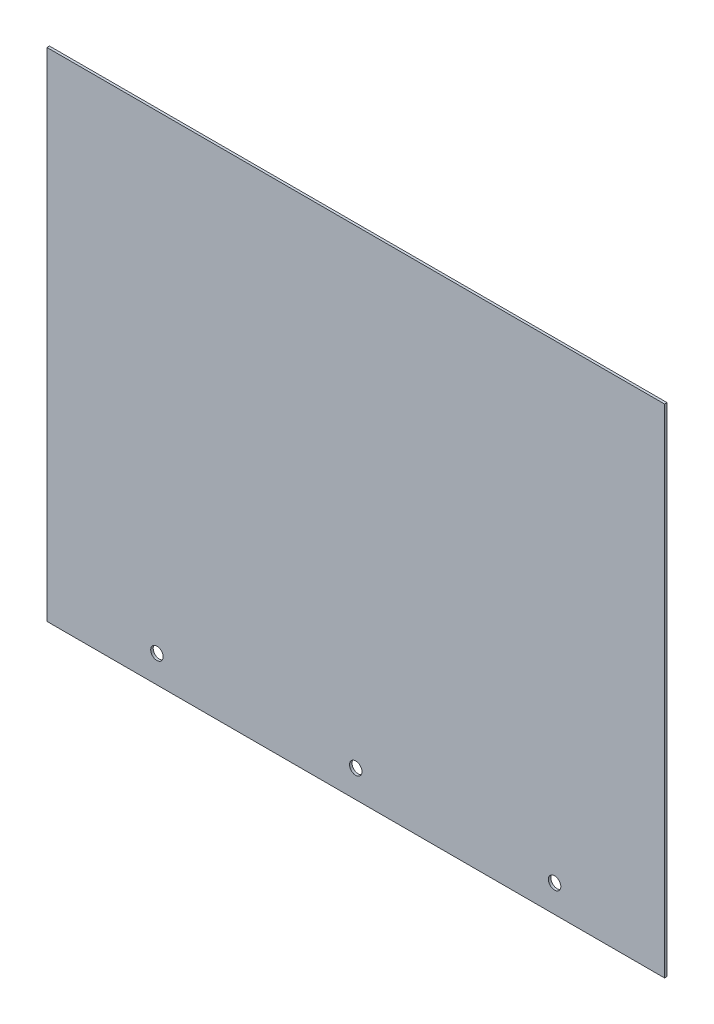
ISO-10303-21;
HEADER;
FILE_DESCRIPTION(('STEP AP214'),'2;1');
FILE_NAME('part.step','',(''),(''),'','','');
FILE_SCHEMA(('AUTOMOTIVE_DESIGN { 1 0 10303 214 1 1 1 1 }'));
ENDSEC;
DATA;
#1=APPLICATION_CONTEXT('core data for automotive mechanical design processes');
#2=APPLICATION_PROTOCOL_DEFINITION('international standard','automotive_design',2000,#1);
#3=PRODUCT_CONTEXT('',#1,'mechanical');
#4=PRODUCT('Part','Part','',(#3));
#5=PRODUCT_RELATED_PRODUCT_CATEGORY('part','',(#4));
#6=PRODUCT_DEFINITION_FORMATION('','',#4);
#7=PRODUCT_DEFINITION_CONTEXT('part definition',#1,'design');
#8=PRODUCT_DEFINITION('design','',#6,#7);
#9=PRODUCT_DEFINITION_SHAPE('','',#8);
#10=(LENGTH_UNIT() NAMED_UNIT(*) SI_UNIT(.MILLI.,.METRE.));
#11=(NAMED_UNIT(*) PLANE_ANGLE_UNIT() SI_UNIT($,.RADIAN.));
#12=(NAMED_UNIT(*) SI_UNIT($,.STERADIAN.) SOLID_ANGLE_UNIT());
#13=UNCERTAINTY_MEASURE_WITH_UNIT(LENGTH_MEASURE(1.E-05),#10,'distance_accuracy_value','');
#14=(GEOMETRIC_REPRESENTATION_CONTEXT(3) GLOBAL_UNCERTAINTY_ASSIGNED_CONTEXT((#13)) GLOBAL_UNIT_ASSIGNED_CONTEXT((#10,
#11,#12)) REPRESENTATION_CONTEXT('',''));
#15=CARTESIAN_POINT('',(0.,0.,0.));
#16=DIRECTION('',(0.,0.,1.));
#17=DIRECTION('',(1.,0.,0.));
#18=AXIS2_PLACEMENT_3D('',#15,#16,#17);
#19=CARTESIAN_POINT('',(0.,0.,0.5));
#20=DIRECTION('',(0.,0.,-1.));
#21=DIRECTION('',(-1.,0.,0.));
#22=AXIS2_PLACEMENT_3D('',#19,#20,#21);
#23=PLANE('',#22);
#24=DIRECTION('',(0.,-1.,0.));
#25=VECTOR('',#24,1.);
#26=CARTESIAN_POINT('',(0.,0.,0.5));
#27=LINE('',#26,#25);
#28=CARTESIAN_POINT('',(0.,200.,0.5));
#29=VERTEX_POINT('',#28);
#30=CARTESIAN_POINT('',(0.,0.,0.5));
#31=VERTEX_POINT('',#30);
#32=EDGE_CURVE('E85',#29,#31,#27,.T.);
#33=ORIENTED_EDGE('',*,*,#32,.T.);
#34=DIRECTION('',(1.,0.,0.));
#35=VECTOR('',#34,1.);
#36=CARTESIAN_POINT('',(0.,0.,0.5));
#37=LINE('',#36,#35);
#38=CARTESIAN_POINT('',(248.5,0.,0.5));
#39=VERTEX_POINT('',#38);
#40=EDGE_CURVE('E80',#31,#39,#37,.T.);
#41=ORIENTED_EDGE('',*,*,#40,.T.);
#42=DIRECTION('',(0.,1.,0.));
#43=VECTOR('',#42,1.);
#44=CARTESIAN_POINT('',(248.5,0.,0.5));
#45=LINE('',#44,#43);
#46=CARTESIAN_POINT('',(248.5,200.,0.5));
#47=VERTEX_POINT('',#46);
#48=EDGE_CURVE('E83',#39,#47,#45,.T.);
#49=ORIENTED_EDGE('',*,*,#48,.T.);
#50=DIRECTION('',(-1.,0.,0.));
#51=VECTOR('',#50,1.);
#52=CARTESIAN_POINT('',(0.,200.,0.5));
#53=LINE('',#52,#51);
#54=EDGE_CURVE('E50',#47,#29,#53,.T.);
#55=ORIENTED_EDGE('',*,*,#54,.T.);
#56=EDGE_LOOP('',(#33,#41,#49,#55));
#57=FACE_BOUND('',#56,.T.);
#58=CARTESIAN_POINT('',(124.25,11.,0.5));
#59=DIRECTION('',(0.,0.,1.));
#60=DIRECTION('',(1.,0.,0.));
#61=AXIS2_PLACEMENT_3D('',#58,#59,#60);
#62=CIRCLE('',#61,2.5);
#63=CARTESIAN_POINT('',(126.75,11.,0.5));
#64=VERTEX_POINT('',#63);
#65=EDGE_CURVE('E100',#64,#64,#62,.T.);
#66=ORIENTED_EDGE('',*,*,#65,.F.);
#67=EDGE_LOOP('',(#66));
#68=FACE_BOUND('',#67,.T.);
#69=CARTESIAN_POINT('',(204.25,11.,0.5));
#70=DIRECTION('',(0.,0.,1.));
#71=DIRECTION('',(1.,0.,0.));
#72=AXIS2_PLACEMENT_3D('',#69,#70,#71);
#73=CIRCLE('',#72,2.5);
#74=CARTESIAN_POINT('',(206.75,11.,0.5));
#75=VERTEX_POINT('',#74);
#76=EDGE_CURVE('E115',#75,#75,#73,.T.);
#77=ORIENTED_EDGE('',*,*,#76,.F.);
#78=EDGE_LOOP('',(#77));
#79=FACE_BOUND('',#78,.T.);
#80=CARTESIAN_POINT('',(44.25,11.,0.5));
#81=DIRECTION('',(0.,0.,1.));
#82=DIRECTION('',(1.,0.,0.));
#83=AXIS2_PLACEMENT_3D('',#80,#81,#82);
#84=CIRCLE('',#83,2.49999999999999);
#85=CARTESIAN_POINT('',(46.75,11.,0.5));
#86=VERTEX_POINT('',#85);
#87=EDGE_CURVE('E121',#86,#86,#84,.T.);
#88=ORIENTED_EDGE('',*,*,#87,.F.);
#89=EDGE_LOOP('',(#88));
#90=FACE_BOUND('',#89,.T.);
#91=ADVANCED_FACE('F33',(#57,#68,#79,#90),#23,.F.);
#92=CARTESIAN_POINT('',(0.,0.,-0.5));
#93=DIRECTION('',(0.,0.,-1.));
#94=DIRECTION('',(-1.,0.,0.));
#95=AXIS2_PLACEMENT_3D('',#92,#93,#94);
#96=PLANE('',#95);
#97=CARTESIAN_POINT('',(204.25,11.,-0.5));
#98=DIRECTION('',(0.,0.,1.));
#99=DIRECTION('',(1.,0.,0.));
#100=AXIS2_PLACEMENT_3D('',#97,#98,#99);
#101=CIRCLE('',#100,2.5);
#102=CARTESIAN_POINT('',(206.75,11.,-0.5));
#103=VERTEX_POINT('',#102);
#104=EDGE_CURVE('E118',#103,#103,#101,.T.);
#105=ORIENTED_EDGE('',*,*,#104,.T.);
#106=EDGE_LOOP('',(#105));
#107=FACE_BOUND('',#106,.T.);
#108=DIRECTION('',(0.,-1.,0.));
#109=VECTOR('',#108,1.);
#110=CARTESIAN_POINT('',(0.,0.,-0.5));
#111=LINE('',#110,#109);
#112=CARTESIAN_POINT('',(0.,200.,-0.5));
#113=VERTEX_POINT('',#112);
#114=CARTESIAN_POINT('',(0.,0.,-0.5));
#115=VERTEX_POINT('',#114);
#116=EDGE_CURVE('E97',#113,#115,#111,.T.);
#117=ORIENTED_EDGE('',*,*,#116,.F.);
#118=DIRECTION('',(-1.,0.,0.));
#119=VECTOR('',#118,1.);
#120=CARTESIAN_POINT('',(0.,200.,-0.5));
#121=LINE('',#120,#119);
#122=CARTESIAN_POINT('',(248.5,200.,-0.5));
#123=VERTEX_POINT('',#122);
#124=EDGE_CURVE('E73',#123,#113,#121,.T.);
#125=ORIENTED_EDGE('',*,*,#124,.F.);
#126=DIRECTION('',(0.,1.,0.));
#127=VECTOR('',#126,1.);
#128=CARTESIAN_POINT('',(248.5,0.,-0.5));
#129=LINE('',#128,#127);
#130=CARTESIAN_POINT('',(248.5,0.,-0.5));
#131=VERTEX_POINT('',#130);
#132=EDGE_CURVE('E67',#131,#123,#129,.T.);
#133=ORIENTED_EDGE('',*,*,#132,.F.);
#134=DIRECTION('',(1.,0.,0.));
#135=VECTOR('',#134,1.);
#136=CARTESIAN_POINT('',(0.,0.,-0.5));
#137=LINE('',#136,#135);
#138=EDGE_CURVE('E89',#115,#131,#137,.T.);
#139=ORIENTED_EDGE('',*,*,#138,.F.);
#140=EDGE_LOOP('',(#117,#125,#133,#139));
#141=FACE_BOUND('',#140,.T.);
#142=CARTESIAN_POINT('',(124.25,11.,-0.5));
#143=DIRECTION('',(0.,0.,1.));
#144=DIRECTION('',(1.,0.,0.));
#145=AXIS2_PLACEMENT_3D('',#142,#143,#144);
#146=CIRCLE('',#145,2.5);
#147=CARTESIAN_POINT('',(126.75,11.,-0.5));
#148=VERTEX_POINT('',#147);
#149=EDGE_CURVE('E112',#148,#148,#146,.T.);
#150=ORIENTED_EDGE('',*,*,#149,.T.);
#151=EDGE_LOOP('',(#150));
#152=FACE_BOUND('',#151,.T.);
#153=CARTESIAN_POINT('',(44.25,11.,-0.5));
#154=DIRECTION('',(0.,0.,1.));
#155=DIRECTION('',(1.,0.,0.));
#156=AXIS2_PLACEMENT_3D('',#153,#154,#155);
#157=CIRCLE('',#156,2.49999999999999);
#158=CARTESIAN_POINT('',(46.75,11.,-0.5));
#159=VERTEX_POINT('',#158);
#160=EDGE_CURVE('E124',#159,#159,#157,.T.);
#161=ORIENTED_EDGE('',*,*,#160,.T.);
#162=EDGE_LOOP('',(#161));
#163=FACE_BOUND('',#162,.T.);
#164=ADVANCED_FACE('F108',(#107,#141,#152,#163),#96,.T.);
#165=CARTESIAN_POINT('',(0.,0.,0.5));
#166=DIRECTION('',(1.,0.,0.));
#167=DIRECTION('',(0.,0.,-1.));
#168=AXIS2_PLACEMENT_3D('',#165,#166,#167);
#169=PLANE('',#168);
#170=ORIENTED_EDGE('',*,*,#116,.T.);
#171=DIRECTION('',(0.,0.,-1.));
#172=VECTOR('',#171,1.);
#173=CARTESIAN_POINT('',(0.,0.,0.5));
#174=LINE('',#173,#172);
#175=EDGE_CURVE('E11',#31,#115,#174,.T.);
#176=ORIENTED_EDGE('',*,*,#175,.F.);
#177=ORIENTED_EDGE('',*,*,#32,.F.);
#178=DIRECTION('',(0.,0.,-1.));
#179=VECTOR('',#178,1.);
#180=CARTESIAN_POINT('',(0.,200.,0.5));
#181=LINE('',#180,#179);
#182=EDGE_CURVE('E93',#29,#113,#181,.T.);
#183=ORIENTED_EDGE('',*,*,#182,.T.);
#184=EDGE_LOOP('',(#170,#176,#177,#183));
#185=FACE_BOUND('',#184,.T.);
#186=ADVANCED_FACE('F35',(#185),#169,.F.);
#187=CARTESIAN_POINT('',(0.,0.,0.5));
#188=DIRECTION('',(0.,1.,0.));
#189=DIRECTION('',(0.,0.,1.));
#190=AXIS2_PLACEMENT_3D('',#187,#188,#189);
#191=PLANE('',#190);
#192=ORIENTED_EDGE('',*,*,#138,.T.);
#193=DIRECTION('',(0.,0.,-1.));
#194=VECTOR('',#193,1.);
#195=CARTESIAN_POINT('',(248.5,0.,0.5));
#196=LINE('',#195,#194);
#197=EDGE_CURVE('E42',#39,#131,#196,.T.);
#198=ORIENTED_EDGE('',*,*,#197,.F.);
#199=ORIENTED_EDGE('',*,*,#40,.F.);
#200=ORIENTED_EDGE('',*,*,#175,.T.);
#201=EDGE_LOOP('',(#192,#198,#199,#200));
#202=FACE_BOUND('',#201,.T.);
#203=ADVANCED_FACE('F88',(#202),#191,.F.);
#204=CARTESIAN_POINT('',(248.5,0.,0.5));
#205=DIRECTION('',(-1.,0.,0.));
#206=DIRECTION('',(0.,-1.,0.));
#207=AXIS2_PLACEMENT_3D('',#204,#205,#206);
#208=PLANE('',#207);
#209=ORIENTED_EDGE('',*,*,#132,.T.);
#210=DIRECTION('',(0.,0.,-1.));
#211=VECTOR('',#210,1.);
#212=CARTESIAN_POINT('',(248.5,200.,0.5));
#213=LINE('',#212,#211);
#214=EDGE_CURVE('E90',#47,#123,#213,.T.);
#215=ORIENTED_EDGE('',*,*,#214,.F.);
#216=ORIENTED_EDGE('',*,*,#48,.F.);
#217=ORIENTED_EDGE('',*,*,#197,.T.);
#218=EDGE_LOOP('',(#209,#215,#216,#217));
#219=FACE_BOUND('',#218,.T.);
#220=ADVANCED_FACE('F91',(#219),#208,.F.);
#221=CARTESIAN_POINT('',(0.,200.,0.5));
#222=DIRECTION('',(0.,-1.,0.));
#223=DIRECTION('',(0.,0.,-1.));
#224=AXIS2_PLACEMENT_3D('',#221,#222,#223);
#225=PLANE('',#224);
#226=ORIENTED_EDGE('',*,*,#124,.T.);
#227=ORIENTED_EDGE('',*,*,#182,.F.);
#228=ORIENTED_EDGE('',*,*,#54,.F.);
#229=ORIENTED_EDGE('',*,*,#214,.T.);
#230=EDGE_LOOP('',(#226,#227,#228,#229));
#231=FACE_BOUND('',#230,.T.);
#232=ADVANCED_FACE('F105',(#231),#225,.F.);
#233=CARTESIAN_POINT('',(124.25,11.,0.5));
#234=DIRECTION('',(0.,0.,-1.));
#235=DIRECTION('',(-1.,0.,0.));
#236=AXIS2_PLACEMENT_3D('',#233,#234,#235);
#237=CYLINDRICAL_SURFACE('',#236,2.5);
#238=ORIENTED_EDGE('',*,*,#65,.T.);
#239=EDGE_LOOP('',(#238));
#240=FACE_BOUND('',#239,.T.);
#241=ORIENTED_EDGE('',*,*,#149,.F.);
#242=EDGE_LOOP('',(#241));
#243=FACE_BOUND('',#242,.T.);
#244=ADVANCED_FACE('F141',(#240,#243),#237,.F.);
#245=CARTESIAN_POINT('',(204.25,11.,0.5));
#246=DIRECTION('',(0.,0.,-1.));
#247=DIRECTION('',(-1.,0.,0.));
#248=AXIS2_PLACEMENT_3D('',#245,#246,#247);
#249=CYLINDRICAL_SURFACE('',#248,2.5);
#250=ORIENTED_EDGE('',*,*,#76,.T.);
#251=EDGE_LOOP('',(#250));
#252=FACE_BOUND('',#251,.T.);
#253=ORIENTED_EDGE('',*,*,#104,.F.);
#254=EDGE_LOOP('',(#253));
#255=FACE_BOUND('',#254,.T.);
#256=ADVANCED_FACE('F187',(#252,#255),#249,.F.);
#257=CARTESIAN_POINT('',(44.25,11.,0.5));
#258=DIRECTION('',(0.,0.,-1.));
#259=DIRECTION('',(-1.,0.,0.));
#260=AXIS2_PLACEMENT_3D('',#257,#258,#259);
#261=CYLINDRICAL_SURFACE('',#260,2.49999999999999);
#262=ORIENTED_EDGE('',*,*,#87,.T.);
#263=EDGE_LOOP('',(#262));
#264=FACE_BOUND('',#263,.T.);
#265=ORIENTED_EDGE('',*,*,#160,.F.);
#266=EDGE_LOOP('',(#265));
#267=FACE_BOUND('',#266,.T.);
#268=ADVANCED_FACE('F130',(#264,#267),#261,.F.);
#269=CLOSED_SHELL('',(#91,#164,#186,#203,#220,#232,#244,#256,#268));
#270=MANIFOLD_SOLID_BREP('B2',#269);
#271=ADVANCED_BREP_SHAPE_REPRESENTATION('',(#18,#270),#14);
#272=SHAPE_DEFINITION_REPRESENTATION(#9,#271);
ENDSEC;
END-ISO-10303-21;
